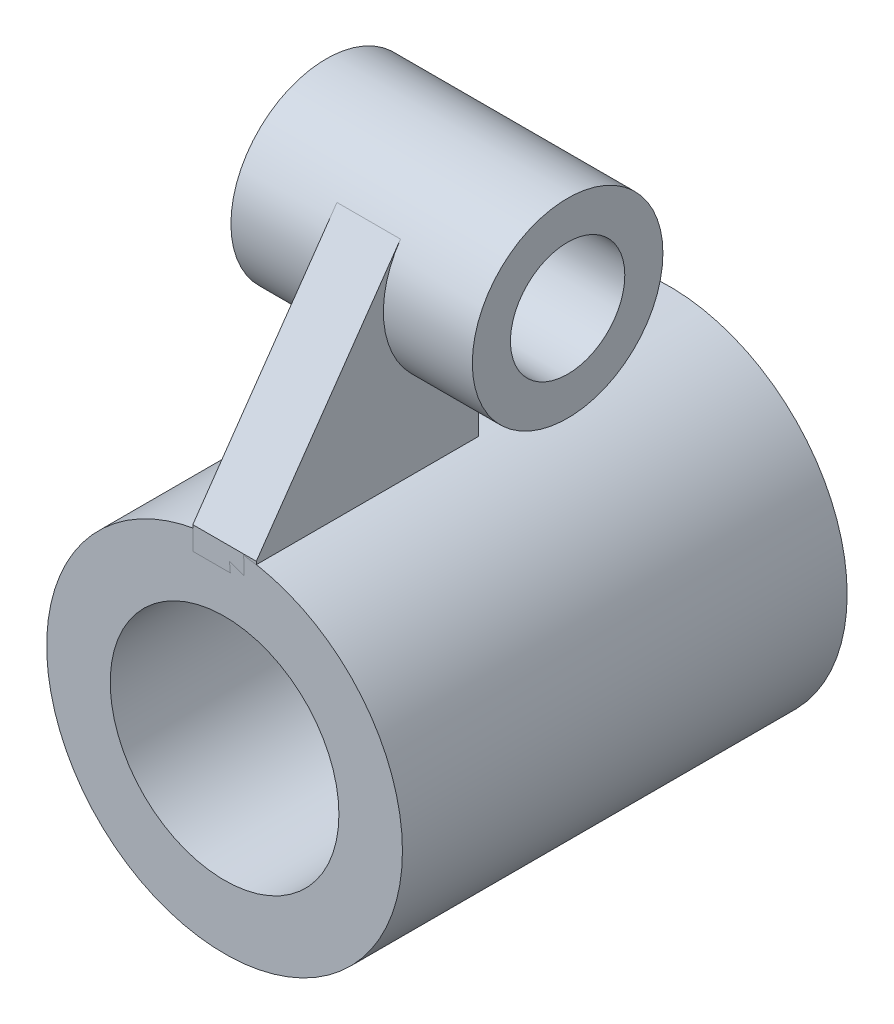
ISO-10303-21;
HEADER;
FILE_DESCRIPTION(('STEP AP214'),'2;1');
FILE_NAME('part.step','',(''),(''),'','','');
FILE_SCHEMA(('AUTOMOTIVE_DESIGN { 1 0 10303 214 1 1 1 1 }'));
ENDSEC;
DATA;
#1=APPLICATION_CONTEXT('core data for automotive mechanical design processes');
#2=APPLICATION_PROTOCOL_DEFINITION('international standard','automotive_design',2000,#1);
#3=PRODUCT_CONTEXT('',#1,'mechanical');
#4=PRODUCT('Part','Part','',(#3));
#5=PRODUCT_RELATED_PRODUCT_CATEGORY('part','',(#4));
#6=PRODUCT_DEFINITION_FORMATION('','',#4);
#7=PRODUCT_DEFINITION_CONTEXT('part definition',#1,'design');
#8=PRODUCT_DEFINITION('design','',#6,#7);
#9=PRODUCT_DEFINITION_SHAPE('','',#8);
#10=(LENGTH_UNIT() NAMED_UNIT(*) SI_UNIT(.MILLI.,.METRE.));
#11=(NAMED_UNIT(*) PLANE_ANGLE_UNIT() SI_UNIT($,.RADIAN.));
#12=(NAMED_UNIT(*) SI_UNIT($,.STERADIAN.) SOLID_ANGLE_UNIT());
#13=UNCERTAINTY_MEASURE_WITH_UNIT(LENGTH_MEASURE(1.E-05),#10,'distance_accuracy_value','');
#14=(GEOMETRIC_REPRESENTATION_CONTEXT(3) GLOBAL_UNCERTAINTY_ASSIGNED_CONTEXT((#13)) GLOBAL_UNIT_ASSIGNED_CONTEXT((#10,
#11,#12)) REPRESENTATION_CONTEXT('',''));
#15=CARTESIAN_POINT('',(0.,0.,0.));
#16=DIRECTION('',(0.,0.,1.));
#17=DIRECTION('',(1.,0.,0.));
#18=AXIS2_PLACEMENT_3D('',#15,#16,#17);
#19=CARTESIAN_POINT('',(9.5,26.,0.));
#20=DIRECTION('',(-1.,0.,0.));
#21=DIRECTION('',(0.,0.,1.));
#22=AXIS2_PLACEMENT_3D('',#19,#20,#21);
#23=CYLINDRICAL_SURFACE('',#22,4.5);
#24=CARTESIAN_POINT('',(-9.5,26.,0.));
#25=DIRECTION('',(1.,0.,0.));
#26=DIRECTION('',(0.,0.,-1.));
#27=AXIS2_PLACEMENT_3D('',#24,#25,#26);
#28=CIRCLE('',#27,4.5);
#29=CARTESIAN_POINT('',(-9.5,26.,-4.5));
#30=VERTEX_POINT('',#29);
#31=EDGE_CURVE('E139',#30,#30,#28,.T.);
#32=ORIENTED_EDGE('',*,*,#31,.F.);
#33=EDGE_LOOP('',(#32));
#34=FACE_BOUND('',#33,.T.);
#35=CARTESIAN_POINT('',(-2.5,26.,0.));
#36=DIRECTION('',(1.,0.,0.));
#37=DIRECTION('',(0.,0.,-1.));
#38=AXIS2_PLACEMENT_3D('',#35,#36,#37);
#39=CIRCLE('',#38,4.5);
#40=CARTESIAN_POINT('',(-2.5,26.,-4.5));
#41=VERTEX_POINT('',#40);
#42=EDGE_CURVE('E128',#41,#41,#39,.T.);
#43=ORIENTED_EDGE('',*,*,#42,.T.);
#44=EDGE_LOOP('',(#43));
#45=FACE_BOUND('',#44,.T.);
#46=ADVANCED_FACE('F57',(#34,#45),#23,.F.);
#47=CARTESIAN_POINT('',(9.5,26.,0.));
#48=DIRECTION('',(1.,0.,0.));
#49=DIRECTION('',(0.,0.,-1.));
#50=AXIS2_PLACEMENT_3D('',#47,#48,#49);
#51=PLANE('',#50);
#52=CARTESIAN_POINT('',(9.5,26.,0.));
#53=DIRECTION('',(1.,0.,0.));
#54=DIRECTION('',(0.,0.,-1.));
#55=AXIS2_PLACEMENT_3D('',#52,#53,#54);
#56=CIRCLE('',#55,7.5);
#57=CARTESIAN_POINT('',(9.5,26.,-7.5));
#58=VERTEX_POINT('',#57);
#59=EDGE_CURVE('E65',#58,#58,#56,.T.);
#60=ORIENTED_EDGE('',*,*,#59,.T.);
#61=EDGE_LOOP('',(#60));
#62=FACE_BOUND('',#61,.T.);
#63=CARTESIAN_POINT('',(9.5,26.,0.));
#64=DIRECTION('',(1.,0.,0.));
#65=DIRECTION('',(0.,0.,-1.));
#66=AXIS2_PLACEMENT_3D('',#63,#64,#65);
#67=CIRCLE('',#66,4.5);
#68=CARTESIAN_POINT('',(9.5,26.,-4.5));
#69=VERTEX_POINT('',#68);
#70=EDGE_CURVE('E140',#69,#69,#67,.T.);
#71=ORIENTED_EDGE('',*,*,#70,.F.);
#72=EDGE_LOOP('',(#71));
#73=FACE_BOUND('',#72,.T.);
#74=ADVANCED_FACE('F155',(#62,#73),#51,.T.);
#75=CARTESIAN_POINT('',(-9.5,26.,0.));
#76=DIRECTION('',(1.,0.,0.));
#77=DIRECTION('',(0.,0.,-1.));
#78=AXIS2_PLACEMENT_3D('',#75,#76,#77);
#79=PLANE('',#78);
#80=CARTESIAN_POINT('',(-9.5,26.,0.));
#81=DIRECTION('',(1.,0.,0.));
#82=DIRECTION('',(0.,0.,-1.));
#83=AXIS2_PLACEMENT_3D('',#80,#81,#82);
#84=CIRCLE('',#83,7.5);
#85=CARTESIAN_POINT('',(-9.5,26.,-7.5));
#86=VERTEX_POINT('',#85);
#87=EDGE_CURVE('E143',#86,#86,#84,.T.);
#88=ORIENTED_EDGE('',*,*,#87,.F.);
#89=EDGE_LOOP('',(#88));
#90=FACE_BOUND('',#89,.T.);
#91=ORIENTED_EDGE('',*,*,#31,.T.);
#92=EDGE_LOOP('',(#91));
#93=FACE_BOUND('',#92,.T.);
#94=ADVANCED_FACE('F152',(#90,#93),#79,.F.);
#95=CARTESIAN_POINT('',(9.5,26.,0.));
#96=DIRECTION('',(-1.,0.,0.));
#97=DIRECTION('',(0.,0.,1.));
#98=AXIS2_PLACEMENT_3D('',#95,#96,#97);
#99=CYLINDRICAL_SURFACE('',#98,7.5);
#100=CARTESIAN_POINT('',(2.5,26.,0.));
#101=DIRECTION('',(1.,0.,0.));
#102=DIRECTION('',(0.,0.,-1.));
#103=AXIS2_PLACEMENT_3D('',#100,#101,#102);
#104=CIRCLE('',#103,7.5);
#105=CARTESIAN_POINT('',(2.5,30.2870363418499,6.15396777726847));
#106=VERTEX_POINT('',#105);
#107=CARTESIAN_POINT('',(2.5,18.5,0.));
#108=VERTEX_POINT('',#107);
#109=EDGE_CURVE('E72',#106,#108,#104,.T.);
#110=ORIENTED_EDGE('',*,*,#109,.T.);
#111=DIRECTION('',(-1.,0.,0.));
#112=VECTOR('',#111,1.);
#113=CARTESIAN_POINT('',(2.5,18.5,0.));
#114=LINE('',#113,#112);
#115=CARTESIAN_POINT('',(-2.5,18.5,0.));
#116=VERTEX_POINT('',#115);
#117=EDGE_CURVE('E132',#108,#116,#114,.T.);
#118=ORIENTED_EDGE('',*,*,#117,.T.);
#119=CARTESIAN_POINT('',(-2.5,26.,0.));
#120=DIRECTION('',(1.,0.,0.));
#121=DIRECTION('',(0.,0.,-1.));
#122=AXIS2_PLACEMENT_3D('',#119,#120,#121);
#123=CIRCLE('',#122,7.5);
#124=CARTESIAN_POINT('',(-2.5,30.2870363418499,6.15396777726847));
#125=VERTEX_POINT('',#124);
#126=EDGE_CURVE('E131',#125,#116,#123,.T.);
#127=ORIENTED_EDGE('',*,*,#126,.F.);
#128=DIRECTION('',(-1.,0.,0.));
#129=VECTOR('',#128,1.);
#130=CARTESIAN_POINT('',(2.5,30.2870363418499,6.15396777726847));
#131=LINE('',#130,#129);
#132=EDGE_CURVE('E77',#106,#125,#131,.T.);
#133=ORIENTED_EDGE('',*,*,#132,.F.);
#134=EDGE_LOOP('',(#110,#118,#127,#133));
#135=FACE_BOUND('',#134,.T.);
#136=ORIENTED_EDGE('',*,*,#59,.F.);
#137=EDGE_LOOP('',(#136));
#138=FACE_BOUND('',#137,.T.);
#139=ORIENTED_EDGE('',*,*,#87,.T.);
#140=EDGE_LOOP('',(#139));
#141=FACE_BOUND('',#140,.T.);
#142=ADVANCED_FACE('F59',(#135,#138,#141),#99,.T.);
#143=CARTESIAN_POINT('',(2.5,26.,0.));
#144=DIRECTION('',(1.,0.,0.));
#145=DIRECTION('',(0.,0.,-1.));
#146=AXIS2_PLACEMENT_3D('',#143,#144,#145);
#147=CIRCLE('',#146,4.5);
#148=CARTESIAN_POINT('',(2.5,26.,-4.5));
#149=VERTEX_POINT('',#148);
#150=EDGE_CURVE('E13',#149,#149,#147,.T.);
#151=ORIENTED_EDGE('',*,*,#150,.F.);
#152=EDGE_LOOP('',(#151));
#153=FACE_BOUND('',#152,.T.);
#154=ORIENTED_EDGE('',*,*,#70,.T.);
#155=EDGE_LOOP('',(#154));
#156=FACE_BOUND('',#155,.T.);
#157=ADVANCED_FACE('F161',(#153,#156),#23,.F.);
#158=CARTESIAN_POINT('',(-2.5,26.,0.));
#159=DIRECTION('',(1.,0.,0.));
#160=DIRECTION('',(0.,0.,-1.));
#161=AXIS2_PLACEMENT_3D('',#158,#159,#160);
#162=PLANE('',#161);
#163=ORIENTED_EDGE('',*,*,#42,.F.);
#164=EDGE_LOOP('',(#163));
#165=FACE_BOUND('',#164,.T.);
#166=ADVANCED_FACE('F164',(#165),#162,.F.);
#167=CARTESIAN_POINT('',(2.5,26.,0.));
#168=DIRECTION('',(1.,0.,0.));
#169=DIRECTION('',(0.,0.,-1.));
#170=AXIS2_PLACEMENT_3D('',#167,#168,#169);
#171=PLANE('',#170);
#172=ORIENTED_EDGE('',*,*,#150,.T.);
#173=EDGE_LOOP('',(#172));
#174=FACE_BOUND('',#173,.T.);
#175=ADVANCED_FACE('F166',(#174),#171,.T.);
#176=CARTESIAN_POINT('',(2.5,12.1832235638492,17.5));
#177=DIRECTION('',(0.,0.,-1.));
#178=DIRECTION('',(-1.,0.,0.));
#179=AXIS2_PLACEMENT_3D('',#176,#177,#178);
#180=PLANE('',#179);
#181=DIRECTION('',(0.,-1.,0.));
#182=VECTOR('',#181,1.);
#183=CARTESIAN_POINT('',(-2.5,12.1832235638492,17.5));
#184=LINE('',#183,#182);
#185=CARTESIAN_POINT('',(-2.5,14.,17.5));
#186=VERTEX_POINT('',#185);
#187=CARTESIAN_POINT('',(-2.5,12.1832235638492,17.5));
#188=VERTEX_POINT('',#187);
#189=EDGE_CURVE('E127',#186,#188,#184,.T.);
#190=ORIENTED_EDGE('',*,*,#189,.T.);
#191=DIRECTION('',(-1.,0.,0.));
#192=VECTOR('',#191,1.);
#193=CARTESIAN_POINT('',(2.5,12.1832235638492,17.5));
#194=LINE('',#193,#192);
#195=CARTESIAN_POINT('',(2.5,12.1832235638492,17.5));
#196=VERTEX_POINT('',#195);
#197=EDGE_CURVE('E107',#196,#188,#194,.T.);
#198=ORIENTED_EDGE('',*,*,#197,.F.);
#199=DIRECTION('',(0.,-1.,0.));
#200=VECTOR('',#199,1.);
#201=CARTESIAN_POINT('',(2.5,12.1832235638492,17.5));
#202=LINE('',#201,#200);
#203=CARTESIAN_POINT('',(2.5,14.,17.5));
#204=VERTEX_POINT('',#203);
#205=EDGE_CURVE('E114',#204,#196,#202,.T.);
#206=ORIENTED_EDGE('',*,*,#205,.F.);
#207=DIRECTION('',(-1.,0.,0.));
#208=VECTOR('',#207,1.);
#209=CARTESIAN_POINT('',(2.5,14.,17.5));
#210=LINE('',#209,#208);
#211=EDGE_CURVE('E192',#204,#186,#210,.T.);
#212=ORIENTED_EDGE('',*,*,#211,.T.);
#213=EDGE_LOOP('',(#190,#198,#206,#212));
#214=FACE_BOUND('',#213,.T.);
#215=ADVANCED_FACE('F125',(#214),#180,.F.);
#216=CARTESIAN_POINT('',(2.5,12.1832235638492,0.));
#217=DIRECTION('',(0.,1.,0.));
#218=DIRECTION('',(0.,0.,1.));
#219=AXIS2_PLACEMENT_3D('',#216,#217,#218);
#220=PLANE('',#219);
#221=DIRECTION('',(0.,0.,-1.));
#222=VECTOR('',#221,1.);
#223=CARTESIAN_POINT('',(-2.5,12.1832235638492,0.));
#224=LINE('',#223,#222);
#225=CARTESIAN_POINT('',(-2.5,12.1832235638492,0.));
#226=VERTEX_POINT('',#225);
#227=EDGE_CURVE('E188',#188,#226,#224,.T.);
#228=ORIENTED_EDGE('',*,*,#227,.T.);
#229=DIRECTION('',(-1.,0.,0.));
#230=VECTOR('',#229,1.);
#231=CARTESIAN_POINT('',(2.5,12.1832235638492,0.));
#232=LINE('',#231,#230);
#233=CARTESIAN_POINT('',(2.5,12.1832235638492,0.));
#234=VERTEX_POINT('',#233);
#235=EDGE_CURVE('E110',#234,#226,#232,.T.);
#236=ORIENTED_EDGE('',*,*,#235,.F.);
#237=DIRECTION('',(0.,0.,-1.));
#238=VECTOR('',#237,1.);
#239=CARTESIAN_POINT('',(2.5,12.1832235638492,0.));
#240=LINE('',#239,#238);
#241=EDGE_CURVE('E102',#196,#234,#240,.T.);
#242=ORIENTED_EDGE('',*,*,#241,.F.);
#243=ORIENTED_EDGE('',*,*,#197,.T.);
#244=EDGE_LOOP('',(#228,#236,#242,#243));
#245=FACE_BOUND('',#244,.T.);
#246=ADVANCED_FACE('F105',(#245),#220,.F.);
#247=CARTESIAN_POINT('',(2.5,18.5,0.));
#248=DIRECTION('',(0.,0.,1.));
#249=DIRECTION('',(1.,0.,0.));
#250=AXIS2_PLACEMENT_3D('',#247,#248,#249);
#251=PLANE('',#250);
#252=DIRECTION('',(0.,1.,0.));
#253=VECTOR('',#252,1.);
#254=CARTESIAN_POINT('',(-2.5,18.5,0.));
#255=LINE('',#254,#253);
#256=EDGE_CURVE('E186',#226,#116,#255,.T.);
#257=ORIENTED_EDGE('',*,*,#256,.T.);
#258=ORIENTED_EDGE('',*,*,#117,.F.);
#259=DIRECTION('',(0.,1.,0.));
#260=VECTOR('',#259,1.);
#261=CARTESIAN_POINT('',(2.5,14.,0.));
#262=LINE('',#261,#260);
#263=EDGE_CURVE('E113',#234,#108,#262,.T.);
#264=ORIENTED_EDGE('',*,*,#263,.F.);
#265=ORIENTED_EDGE('',*,*,#235,.T.);
#266=EDGE_LOOP('',(#257,#258,#264,#265));
#267=FACE_BOUND('',#266,.T.);
#268=ADVANCED_FACE('F197',(#267),#251,.F.);
#269=CARTESIAN_POINT('',(2.5,14.,17.5));
#270=DIRECTION('',(0.,-0.57160484557998,-0.820529036969129));
#271=DIRECTION('',(0.,0.820529036969129,-0.57160484557998));
#272=AXIS2_PLACEMENT_3D('',#269,#270,#271);
#273=PLANE('',#272);
#274=DIRECTION('',(0.,-0.820529036969129,0.57160484557998));
#275=VECTOR('',#274,1.);
#276=CARTESIAN_POINT('',(-2.5,14.,17.5));
#277=LINE('',#276,#275);
#278=EDGE_CURVE('E123',#125,#186,#277,.T.);
#279=ORIENTED_EDGE('',*,*,#278,.T.);
#280=ORIENTED_EDGE('',*,*,#211,.F.);
#281=DIRECTION('',(0.,-0.820529036969129,0.57160484557998));
#282=VECTOR('',#281,1.);
#283=CARTESIAN_POINT('',(2.5,14.,17.5));
#284=LINE('',#283,#282);
#285=EDGE_CURVE('E119',#106,#204,#284,.T.);
#286=ORIENTED_EDGE('',*,*,#285,.F.);
#287=ORIENTED_EDGE('',*,*,#132,.T.);
#288=EDGE_LOOP('',(#279,#280,#286,#287));
#289=FACE_BOUND('',#288,.T.);
#290=ADVANCED_FACE('F182',(#289),#273,.F.);
#291=ORIENTED_EDGE('',*,*,#109,.F.);
#292=ORIENTED_EDGE('',*,*,#285,.T.);
#293=ORIENTED_EDGE('',*,*,#205,.T.);
#294=ORIENTED_EDGE('',*,*,#241,.T.);
#295=ORIENTED_EDGE('',*,*,#263,.T.);
#296=EDGE_LOOP('',(#291,#292,#293,#294,#295));
#297=FACE_BOUND('',#296,.T.);
#298=ADVANCED_FACE('F117',(#297),#171,.T.);
#299=ORIENTED_EDGE('',*,*,#278,.F.);
#300=ORIENTED_EDGE('',*,*,#126,.T.);
#301=ORIENTED_EDGE('',*,*,#256,.F.);
#302=ORIENTED_EDGE('',*,*,#227,.F.);
#303=ORIENTED_EDGE('',*,*,#189,.F.);
#304=EDGE_LOOP('',(#299,#300,#301,#302,#303));
#305=FACE_BOUND('',#304,.T.);
#306=ADVANCED_FACE('F168',(#305),#162,.F.);
#307=CLOSED_SHELL('',(#46,#74,#94,#142,#157,#166,#175,#215,#246,#268,#290,#298,#306));
#308=MANIFOLD_SOLID_BREP('B2',#307);
#309=CARTESIAN_POINT('',(0.,0.,17.5));
#310=DIRECTION('',(0.,0.,1.));
#311=DIRECTION('',(1.,0.,0.));
#312=AXIS2_PLACEMENT_3D('',#309,#310,#311);
#313=PLANE('',#312);
#314=CARTESIAN_POINT('',(0.,0.,17.5));
#315=DIRECTION('',(0.,0.,1.));
#316=DIRECTION('',(1.,0.,0.));
#317=AXIS2_PLACEMENT_3D('',#314,#315,#316);
#318=CIRCLE('',#317,14.);
#319=CARTESIAN_POINT('',(14.,0.,17.5));
#320=VERTEX_POINT('',#319);
#321=EDGE_CURVE('E56',#320,#320,#318,.T.);
#322=ORIENTED_EDGE('',*,*,#321,.T.);
#323=EDGE_LOOP('',(#322));
#324=FACE_BOUND('',#323,.T.);
#325=CARTESIAN_POINT('',(0.,0.,17.5));
#326=DIRECTION('',(0.,0.,1.));
#327=DIRECTION('',(1.,0.,0.));
#328=AXIS2_PLACEMENT_3D('',#325,#326,#327);
#329=CIRCLE('',#328,9.);
#330=CARTESIAN_POINT('',(9.,0.,17.5));
#331=VERTEX_POINT('',#330);
#332=EDGE_CURVE('E334',#331,#331,#329,.T.);
#333=ORIENTED_EDGE('',*,*,#332,.F.);
#334=EDGE_LOOP('',(#333));
#335=FACE_BOUND('',#334,.T.);
#336=ADVANCED_FACE('F323',(#324,#335),#313,.T.);
#337=CARTESIAN_POINT('',(0.,0.,-17.5));
#338=DIRECTION('',(0.,0.,1.));
#339=DIRECTION('',(1.,0.,0.));
#340=AXIS2_PLACEMENT_3D('',#337,#338,#339);
#341=PLANE('',#340);
#342=CARTESIAN_POINT('',(0.,0.,-17.5));
#343=DIRECTION('',(0.,0.,1.));
#344=DIRECTION('',(1.,0.,0.));
#345=AXIS2_PLACEMENT_3D('',#342,#343,#344);
#346=CIRCLE('',#345,14.);
#347=CARTESIAN_POINT('',(14.,0.,-17.5));
#348=VERTEX_POINT('',#347);
#349=EDGE_CURVE('E327',#348,#348,#346,.T.);
#350=ORIENTED_EDGE('',*,*,#349,.F.);
#351=EDGE_LOOP('',(#350));
#352=FACE_BOUND('',#351,.T.);
#353=CARTESIAN_POINT('',(0.,0.,-17.5));
#354=DIRECTION('',(0.,0.,1.));
#355=DIRECTION('',(1.,0.,0.));
#356=AXIS2_PLACEMENT_3D('',#353,#354,#355);
#357=CIRCLE('',#356,9.);
#358=CARTESIAN_POINT('',(9.,0.,-17.5));
#359=VERTEX_POINT('',#358);
#360=EDGE_CURVE('E336',#359,#359,#357,.T.);
#361=ORIENTED_EDGE('',*,*,#360,.T.);
#362=EDGE_LOOP('',(#361));
#363=FACE_BOUND('',#362,.T.);
#364=ADVANCED_FACE('F346',(#352,#363),#341,.F.);
#365=CARTESIAN_POINT('',(0.,0.,17.5));
#366=DIRECTION('',(0.,0.,-1.));
#367=DIRECTION('',(-1.,0.,0.));
#368=AXIS2_PLACEMENT_3D('',#365,#366,#367);
#369=CYLINDRICAL_SURFACE('',#368,14.);
#370=ORIENTED_EDGE('',*,*,#321,.F.);
#371=EDGE_LOOP('',(#370));
#372=FACE_BOUND('',#371,.T.);
#373=ORIENTED_EDGE('',*,*,#349,.T.);
#374=EDGE_LOOP('',(#373));
#375=FACE_BOUND('',#374,.T.);
#376=ADVANCED_FACE('F325',(#372,#375),#369,.T.);
#377=CARTESIAN_POINT('',(0.,0.,17.5));
#378=DIRECTION('',(0.,0.,-1.));
#379=DIRECTION('',(-1.,0.,0.));
#380=AXIS2_PLACEMENT_3D('',#377,#378,#379);
#381=CYLINDRICAL_SURFACE('',#380,9.);
#382=ORIENTED_EDGE('',*,*,#332,.T.);
#383=EDGE_LOOP('',(#382));
#384=FACE_BOUND('',#383,.T.);
#385=ORIENTED_EDGE('',*,*,#360,.F.);
#386=EDGE_LOOP('',(#385));
#387=FACE_BOUND('',#386,.T.);
#388=ADVANCED_FACE('F342',(#384,#387),#381,.F.);
#389=CLOSED_SHELL('',(#336,#364,#376,#388));
#390=MANIFOLD_SOLID_BREP('B7',#389);
#391=ADVANCED_BREP_SHAPE_REPRESENTATION('',(#18,#308,#390),#14);
#392=SHAPE_DEFINITION_REPRESENTATION(#9,#391);
ENDSEC;
END-ISO-10303-21;
